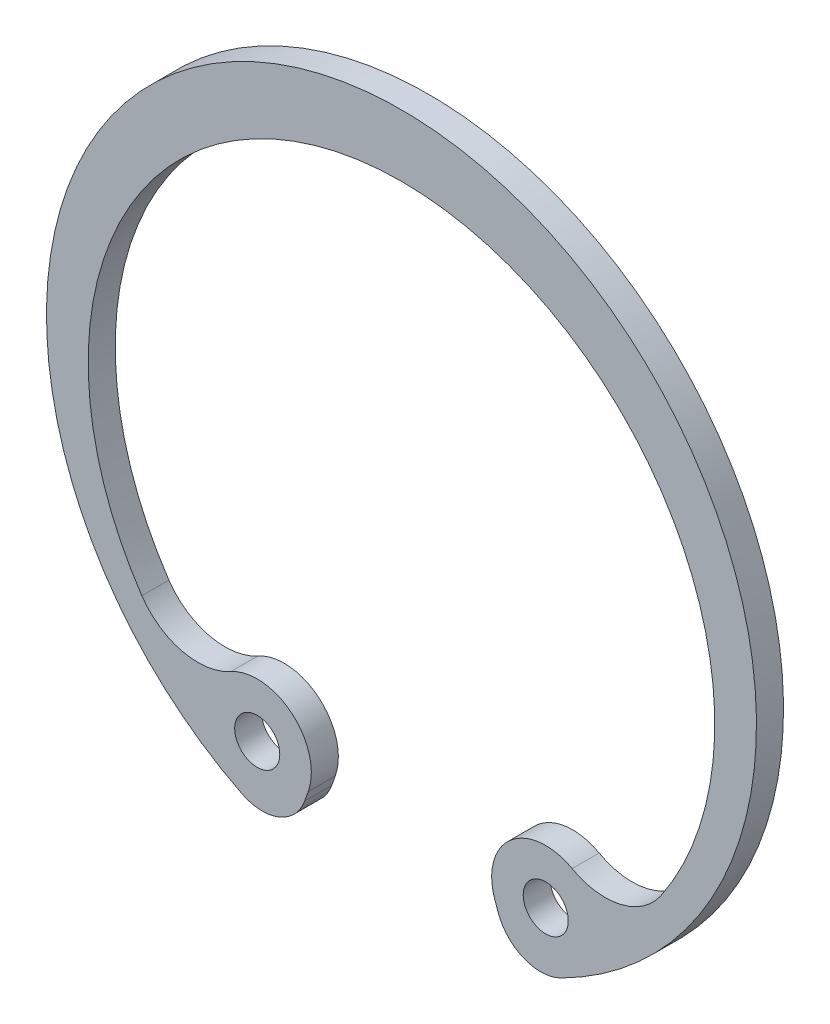
ISO-10303-21;
HEADER;
FILE_DESCRIPTION(('STEP AP214'),'2;1');
FILE_NAME('part.step','',(''),(''),'','','');
FILE_SCHEMA(('AUTOMOTIVE_DESIGN { 1 0 10303 214 1 1 1 1 }'));
ENDSEC;
DATA;
#1=APPLICATION_CONTEXT('core data for automotive mechanical design processes');
#2=APPLICATION_PROTOCOL_DEFINITION('international standard','automotive_design',2000,#1);
#3=PRODUCT_CONTEXT('',#1,'mechanical');
#4=PRODUCT('Part','Part','',(#3));
#5=PRODUCT_RELATED_PRODUCT_CATEGORY('part','',(#4));
#6=PRODUCT_DEFINITION_FORMATION('','',#4);
#7=PRODUCT_DEFINITION_CONTEXT('part definition',#1,'design');
#8=PRODUCT_DEFINITION('design','',#6,#7);
#9=PRODUCT_DEFINITION_SHAPE('','',#8);
#10=(LENGTH_UNIT() NAMED_UNIT(*) SI_UNIT(.MILLI.,.METRE.));
#11=(NAMED_UNIT(*) PLANE_ANGLE_UNIT() SI_UNIT($,.RADIAN.));
#12=(NAMED_UNIT(*) SI_UNIT($,.STERADIAN.) SOLID_ANGLE_UNIT());
#13=UNCERTAINTY_MEASURE_WITH_UNIT(LENGTH_MEASURE(1.E-05),#10,'distance_accuracy_value','');
#14=(GEOMETRIC_REPRESENTATION_CONTEXT(3) GLOBAL_UNCERTAINTY_ASSIGNED_CONTEXT((#13)) GLOBAL_UNIT_ASSIGNED_CONTEXT((#10,
#11,#12)) REPRESENTATION_CONTEXT('',''));
#15=CARTESIAN_POINT('',(0.,0.,0.));
#16=DIRECTION('',(0.,0.,1.));
#17=DIRECTION('',(1.,0.,0.));
#18=AXIS2_PLACEMENT_3D('',#15,#16,#17);
#19=CARTESIAN_POINT('',(-6.17774308325366,-11.384054314326,1.2));
#20=DIRECTION('',(0.,0.,1.));
#21=DIRECTION('',(1.,0.,0.));
#22=AXIS2_PLACEMENT_3D('',#19,#20,#21);
#23=PLANE('',#22);
#24=CARTESIAN_POINT('',(-6.4,-10.8159079887135,1.2));
#25=DIRECTION('',(0.,0.,1.));
#26=DIRECTION('',(1.,0.,0.));
#27=AXIS2_PLACEMENT_3D('',#24,#25,#26);
#28=CIRCLE('',#27,1.);
#29=CARTESIAN_POINT('',(-5.4,-10.8159079887135,1.2));
#30=VERTEX_POINT('',#29);
#31=EDGE_CURVE('E145',#30,#30,#28,.T.);
#32=ORIENTED_EDGE('',*,*,#31,.F.);
#33=EDGE_LOOP('',(#32));
#34=FACE_BOUND('',#33,.T.);
#35=CARTESIAN_POINT('',(-6.17774308325366,-11.384054314326,1.2));
#36=DIRECTION('',(0.,0.,1.));
#37=DIRECTION('',(1.,0.,0.));
#38=AXIS2_PLACEMENT_3D('',#35,#36,#37);
#39=CIRCLE('',#38,2.);
#40=CARTESIAN_POINT('',(-7.07632389536327,-13.1708258509553,1.2));
#41=VERTEX_POINT('',#40);
#42=CARTESIAN_POINT('',(-4.29368008749084,-12.0551032156717,1.2));
#43=VERTEX_POINT('',#42);
#44=EDGE_CURVE('E160',#41,#43,#39,.T.);
#45=ORIENTED_EDGE('',*,*,#44,.T.);
#46=DIRECTION('',(0.335524450672837,0.942031497881409,0.));
#47=VECTOR('',#46,1.);
#48=CARTESIAN_POINT('',(-4.13912440508462,-11.6211666703283,1.2));
#49=LINE('',#48,#47);
#50=CARTESIAN_POINT('',(-4.13912440508462,-11.6211666703283,1.2));
#51=VERTEX_POINT('',#50);
#52=EDGE_CURVE('E98',#43,#51,#49,.T.);
#53=ORIENTED_EDGE('',*,*,#52,.T.);
#54=CARTESIAN_POINT('',(-6.4,-10.8159079887135,1.2));
#55=DIRECTION('',(0.,0.,1.));
#56=DIRECTION('',(1.,0.,0.));
#57=AXIS2_PLACEMENT_3D('',#54,#55,#56);
#58=CIRCLE('',#57,2.4);
#59=CARTESIAN_POINT('',(-7.57002157304939,-8.72042486575613,1.2));
#60=VERTEX_POINT('',#59);
#61=EDGE_CURVE('E181',#51,#60,#58,.T.);
#62=ORIENTED_EDGE('',*,*,#61,.T.);
#63=CARTESIAN_POINT('',(-9.03254853936113,-6.10107096205946,1.2));
#64=DIRECTION('',(0.,0.,-1.));
#65=DIRECTION('',(1.,0.,0.));
#66=AXIS2_PLACEMENT_3D('',#63,#64,#65);
#67=CIRCLE('',#66,3.);
#68=CARTESIAN_POINT('',(-11.5185710731302,-7.78026480482811,1.2));
#69=VERTEX_POINT('',#68);
#70=EDGE_CURVE('E200',#60,#69,#67,.T.);
#71=ORIENTED_EDGE('',*,*,#70,.T.);
#72=CARTESIAN_POINT('',(0.,0.,1.2));
#73=DIRECTION('',(0.,0.,-1.));
#74=DIRECTION('',(1.,0.,0.));
#75=AXIS2_PLACEMENT_3D('',#72,#73,#74);
#76=CIRCLE('',#75,13.9);
#77=CARTESIAN_POINT('',(11.5185710731302,-7.78026480482812,1.2));
#78=VERTEX_POINT('',#77);
#79=EDGE_CURVE('E197',#69,#78,#76,.T.);
#80=ORIENTED_EDGE('',*,*,#79,.T.);
#81=CARTESIAN_POINT('',(9.03254853936113,-6.10107096205946,1.2));
#82=DIRECTION('',(0.,0.,-1.));
#83=DIRECTION('',(-1.,0.,0.));
#84=AXIS2_PLACEMENT_3D('',#81,#82,#83);
#85=CIRCLE('',#84,3.);
#86=CARTESIAN_POINT('',(7.57002157304939,-8.72042486575613,1.2));
#87=VERTEX_POINT('',#86);
#88=EDGE_CURVE('E199',#78,#87,#85,.T.);
#89=ORIENTED_EDGE('',*,*,#88,.T.);
#90=CARTESIAN_POINT('',(6.4,-10.8159079887135,1.2));
#91=DIRECTION('',(0.,0.,1.));
#92=DIRECTION('',(-1.,0.,0.));
#93=AXIS2_PLACEMENT_3D('',#90,#91,#92);
#94=CIRCLE('',#93,2.4);
#95=CARTESIAN_POINT('',(4.13912440508462,-11.6211666703283,1.2));
#96=VERTEX_POINT('',#95);
#97=EDGE_CURVE('E123',#87,#96,#94,.T.);
#98=ORIENTED_EDGE('',*,*,#97,.T.);
#99=DIRECTION('',(0.335524450672837,-0.942031497881409,0.));
#100=VECTOR('',#99,1.);
#101=CARTESIAN_POINT('',(4.13912440508462,-11.6211666703283,1.2));
#102=LINE('',#101,#100);
#103=CARTESIAN_POINT('',(4.29368008749084,-12.0551032156717,1.2));
#104=VERTEX_POINT('',#103);
#105=EDGE_CURVE('E117',#96,#104,#102,.T.);
#106=ORIENTED_EDGE('',*,*,#105,.T.);
#107=CARTESIAN_POINT('',(6.17774308325366,-11.384054314326,1.2));
#108=DIRECTION('',(0.,0.,1.));
#109=DIRECTION('',(-1.,0.,0.));
#110=AXIS2_PLACEMENT_3D('',#107,#108,#109);
#111=CIRCLE('',#110,2.);
#112=CARTESIAN_POINT('',(7.07632389536328,-13.1708258509553,1.2));
#113=VERTEX_POINT('',#112);
#114=EDGE_CURVE('E121',#104,#113,#111,.T.);
#115=ORIENTED_EDGE('',*,*,#114,.T.);
#116=CARTESIAN_POINT('',(0.,0.9,1.2));
#117=DIRECTION('',(0.,0.,1.));
#118=DIRECTION('',(-1.,0.,0.));
#119=AXIS2_PLACEMENT_3D('',#116,#117,#118);
#120=CIRCLE('',#119,15.75);
#121=EDGE_CURVE('E49',#113,#41,#120,.T.);
#122=ORIENTED_EDGE('',*,*,#121,.T.);
#123=EDGE_LOOP('',(#45,#53,#62,#71,#80,#89,#98,#106,#115,#122));
#124=FACE_BOUND('',#123,.T.);
#125=CARTESIAN_POINT('',(6.4,-10.8159079887135,1.2));
#126=DIRECTION('',(0.,0.,1.));
#127=DIRECTION('',(-1.,0.,0.));
#128=AXIS2_PLACEMENT_3D('',#125,#126,#127);
#129=CIRCLE('',#128,1.);
#130=CARTESIAN_POINT('',(5.4,-10.8159079887135,1.2));
#131=VERTEX_POINT('',#130);
#132=EDGE_CURVE('E211',#131,#131,#129,.T.);
#133=ORIENTED_EDGE('',*,*,#132,.F.);
#134=EDGE_LOOP('',(#133));
#135=FACE_BOUND('',#134,.T.);
#136=ADVANCED_FACE('F32',(#34,#124,#135),#23,.T.);
#137=CARTESIAN_POINT('',(-6.17774308325366,-11.384054314326,0.));
#138=DIRECTION('',(0.,0.,1.));
#139=DIRECTION('',(1.,0.,0.));
#140=AXIS2_PLACEMENT_3D('',#137,#138,#139);
#141=PLANE('',#140);
#142=CARTESIAN_POINT('',(-6.17774308325366,-11.384054314326,0.));
#143=DIRECTION('',(0.,0.,1.));
#144=DIRECTION('',(1.,0.,0.));
#145=AXIS2_PLACEMENT_3D('',#142,#143,#144);
#146=CIRCLE('',#145,2.);
#147=CARTESIAN_POINT('',(-7.07632389536327,-13.1708258509553,0.));
#148=VERTEX_POINT('',#147);
#149=CARTESIAN_POINT('',(-4.29368008749084,-12.0551032156717,0.));
#150=VERTEX_POINT('',#149);
#151=EDGE_CURVE('E141',#148,#150,#146,.T.);
#152=ORIENTED_EDGE('',*,*,#151,.F.);
#153=CARTESIAN_POINT('',(0.,0.9,0.));
#154=DIRECTION('',(0.,0.,1.));
#155=DIRECTION('',(-1.,0.,0.));
#156=AXIS2_PLACEMENT_3D('',#153,#154,#155);
#157=CIRCLE('',#156,15.75);
#158=CARTESIAN_POINT('',(7.07632389536328,-13.1708258509553,0.));
#159=VERTEX_POINT('',#158);
#160=EDGE_CURVE('E90',#159,#148,#157,.T.);
#161=ORIENTED_EDGE('',*,*,#160,.F.);
#162=CARTESIAN_POINT('',(6.17774308325366,-11.384054314326,0.));
#163=DIRECTION('',(0.,0.,1.));
#164=DIRECTION('',(-1.,0.,0.));
#165=AXIS2_PLACEMENT_3D('',#162,#163,#164);
#166=CIRCLE('',#165,2.);
#167=CARTESIAN_POINT('',(4.29368008749084,-12.0551032156717,0.));
#168=VERTEX_POINT('',#167);
#169=EDGE_CURVE('E84',#168,#159,#166,.T.);
#170=ORIENTED_EDGE('',*,*,#169,.F.);
#171=DIRECTION('',(0.335524450672837,-0.942031497881409,0.));
#172=VECTOR('',#171,1.);
#173=CARTESIAN_POINT('',(4.13912440508462,-11.6211666703283,0.));
#174=LINE('',#173,#172);
#175=CARTESIAN_POINT('',(4.13912440508462,-11.6211666703283,0.));
#176=VERTEX_POINT('',#175);
#177=EDGE_CURVE('E131',#176,#168,#174,.T.);
#178=ORIENTED_EDGE('',*,*,#177,.F.);
#179=CARTESIAN_POINT('',(6.4,-10.8159079887135,0.));
#180=DIRECTION('',(0.,0.,1.));
#181=DIRECTION('',(-1.,0.,0.));
#182=AXIS2_PLACEMENT_3D('',#179,#180,#181);
#183=CIRCLE('',#182,2.4);
#184=CARTESIAN_POINT('',(7.57002157304939,-8.72042486575613,0.));
#185=VERTEX_POINT('',#184);
#186=EDGE_CURVE('E155',#185,#176,#183,.T.);
#187=ORIENTED_EDGE('',*,*,#186,.F.);
#188=CARTESIAN_POINT('',(9.03254853936113,-6.10107096205946,0.));
#189=DIRECTION('',(0.,0.,-1.));
#190=DIRECTION('',(-1.,0.,0.));
#191=AXIS2_PLACEMENT_3D('',#188,#189,#190);
#192=CIRCLE('',#191,3.);
#193=CARTESIAN_POINT('',(11.5185710731302,-7.78026480482812,0.));
#194=VERTEX_POINT('',#193);
#195=EDGE_CURVE('E153',#194,#185,#192,.T.);
#196=ORIENTED_EDGE('',*,*,#195,.F.);
#197=CARTESIAN_POINT('',(0.,0.,0.));
#198=DIRECTION('',(0.,0.,-1.));
#199=DIRECTION('',(1.,0.,0.));
#200=AXIS2_PLACEMENT_3D('',#197,#198,#199);
#201=CIRCLE('',#200,13.9);
#202=CARTESIAN_POINT('',(-11.5185710731302,-7.78026480482811,0.));
#203=VERTEX_POINT('',#202);
#204=EDGE_CURVE('E151',#203,#194,#201,.T.);
#205=ORIENTED_EDGE('',*,*,#204,.F.);
#206=CARTESIAN_POINT('',(-9.03254853936113,-6.10107096205946,0.));
#207=DIRECTION('',(0.,0.,-1.));
#208=DIRECTION('',(1.,0.,0.));
#209=AXIS2_PLACEMENT_3D('',#206,#207,#208);
#210=CIRCLE('',#209,3.);
#211=CARTESIAN_POINT('',(-7.57002157304939,-8.72042486575613,0.));
#212=VERTEX_POINT('',#211);
#213=EDGE_CURVE('E149',#212,#203,#210,.T.);
#214=ORIENTED_EDGE('',*,*,#213,.F.);
#215=CARTESIAN_POINT('',(-6.4,-10.8159079887135,0.));
#216=DIRECTION('',(0.,0.,1.));
#217=DIRECTION('',(1.,0.,0.));
#218=AXIS2_PLACEMENT_3D('',#215,#216,#217);
#219=CIRCLE('',#218,2.4);
#220=CARTESIAN_POINT('',(-4.13912440508462,-11.6211666703283,0.));
#221=VERTEX_POINT('',#220);
#222=EDGE_CURVE('E147',#221,#212,#219,.T.);
#223=ORIENTED_EDGE('',*,*,#222,.F.);
#224=DIRECTION('',(0.335524450672837,0.942031497881409,0.));
#225=VECTOR('',#224,1.);
#226=CARTESIAN_POINT('',(-4.13912440508462,-11.6211666703283,0.));
#227=LINE('',#226,#225);
#228=EDGE_CURVE('E144',#150,#221,#227,.T.);
#229=ORIENTED_EDGE('',*,*,#228,.F.);
#230=EDGE_LOOP('',(#152,#161,#170,#178,#187,#196,#205,#214,#223,#229));
#231=FACE_BOUND('',#230,.T.);
#232=CARTESIAN_POINT('',(-6.4,-10.8159079887135,0.));
#233=DIRECTION('',(0.,0.,1.));
#234=DIRECTION('',(1.,0.,0.));
#235=AXIS2_PLACEMENT_3D('',#232,#233,#234);
#236=CIRCLE('',#235,1.);
#237=CARTESIAN_POINT('',(-5.4,-10.8159079887135,0.));
#238=VERTEX_POINT('',#237);
#239=EDGE_CURVE('E208',#238,#238,#236,.T.);
#240=ORIENTED_EDGE('',*,*,#239,.T.);
#241=EDGE_LOOP('',(#240));
#242=FACE_BOUND('',#241,.T.);
#243=CARTESIAN_POINT('',(6.4,-10.8159079887135,0.));
#244=DIRECTION('',(0.,0.,1.));
#245=DIRECTION('',(-1.,0.,0.));
#246=AXIS2_PLACEMENT_3D('',#243,#244,#245);
#247=CIRCLE('',#246,1.);
#248=CARTESIAN_POINT('',(5.4,-10.8159079887135,0.));
#249=VERTEX_POINT('',#248);
#250=EDGE_CURVE('E214',#249,#249,#247,.T.);
#251=ORIENTED_EDGE('',*,*,#250,.T.);
#252=EDGE_LOOP('',(#251));
#253=FACE_BOUND('',#252,.T.);
#254=ADVANCED_FACE('F185',(#231,#242,#253),#141,.F.);
#255=CARTESIAN_POINT('',(-6.17774308325366,-11.384054314326,1.2));
#256=DIRECTION('',(0.,0.,-1.));
#257=DIRECTION('',(-1.,0.,0.));
#258=AXIS2_PLACEMENT_3D('',#255,#256,#257);
#259=CYLINDRICAL_SURFACE('',#258,2.);
#260=ORIENTED_EDGE('',*,*,#151,.T.);
#261=DIRECTION('',(0.,0.,-1.));
#262=VECTOR('',#261,1.);
#263=CARTESIAN_POINT('',(-4.29368008749084,-12.0551032156717,1.2));
#264=LINE('',#263,#262);
#265=EDGE_CURVE('E11',#43,#150,#264,.T.);
#266=ORIENTED_EDGE('',*,*,#265,.F.);
#267=ORIENTED_EDGE('',*,*,#44,.F.);
#268=DIRECTION('',(0.,0.,-1.));
#269=VECTOR('',#268,1.);
#270=CARTESIAN_POINT('',(-7.07632389536327,-13.1708258509553,1.2));
#271=LINE('',#270,#269);
#272=EDGE_CURVE('E137',#41,#148,#271,.T.);
#273=ORIENTED_EDGE('',*,*,#272,.T.);
#274=EDGE_LOOP('',(#260,#266,#267,#273));
#275=FACE_BOUND('',#274,.T.);
#276=ADVANCED_FACE('F34',(#275),#259,.T.);
#277=CARTESIAN_POINT('',(-4.13912440508462,-11.6211666703283,1.2));
#278=DIRECTION('',(-0.942031497881409,0.335524450672837,0.));
#279=DIRECTION('',(-0.335524450672837,-0.942031497881409,0.));
#280=AXIS2_PLACEMENT_3D('',#277,#278,#279);
#281=PLANE('',#280);
#282=ORIENTED_EDGE('',*,*,#228,.T.);
#283=DIRECTION('',(0.,0.,-1.));
#284=VECTOR('',#283,1.);
#285=CARTESIAN_POINT('',(-4.13912440508462,-11.6211666703283,1.2));
#286=LINE('',#285,#284);
#287=EDGE_CURVE('E41',#51,#221,#286,.T.);
#288=ORIENTED_EDGE('',*,*,#287,.F.);
#289=ORIENTED_EDGE('',*,*,#52,.F.);
#290=ORIENTED_EDGE('',*,*,#265,.T.);
#291=EDGE_LOOP('',(#282,#288,#289,#290));
#292=FACE_BOUND('',#291,.T.);
#293=ADVANCED_FACE('F254',(#292),#281,.F.);
#294=CARTESIAN_POINT('',(-6.4,-10.8159079887135,1.2));
#295=DIRECTION('',(0.,0.,-1.));
#296=DIRECTION('',(-1.,0.,0.));
#297=AXIS2_PLACEMENT_3D('',#294,#295,#296);
#298=CYLINDRICAL_SURFACE('',#297,2.4);
#299=ORIENTED_EDGE('',*,*,#222,.T.);
#300=DIRECTION('',(0.,0.,-1.));
#301=VECTOR('',#300,1.);
#302=CARTESIAN_POINT('',(-7.57002157304939,-8.72042486575613,1.2));
#303=LINE('',#302,#301);
#304=EDGE_CURVE('E173',#60,#212,#303,.T.);
#305=ORIENTED_EDGE('',*,*,#304,.F.);
#306=ORIENTED_EDGE('',*,*,#61,.F.);
#307=ORIENTED_EDGE('',*,*,#287,.T.);
#308=EDGE_LOOP('',(#299,#305,#306,#307));
#309=FACE_BOUND('',#308,.T.);
#310=ADVANCED_FACE('F179',(#309),#298,.T.);
#311=CARTESIAN_POINT('',(-9.03254853936113,-6.10107096205946,1.2));
#312=DIRECTION('',(0.,0.,-1.));
#313=DIRECTION('',(-1.,0.,0.));
#314=AXIS2_PLACEMENT_3D('',#311,#312,#313);
#315=CYLINDRICAL_SURFACE('',#314,3.);
#316=ORIENTED_EDGE('',*,*,#213,.T.);
#317=DIRECTION('',(0.,0.,-1.));
#318=VECTOR('',#317,1.);
#319=CARTESIAN_POINT('',(-11.5185710731302,-7.78026480482811,1.2));
#320=LINE('',#319,#318);
#321=EDGE_CURVE('E170',#69,#203,#320,.T.);
#322=ORIENTED_EDGE('',*,*,#321,.F.);
#323=ORIENTED_EDGE('',*,*,#70,.F.);
#324=ORIENTED_EDGE('',*,*,#304,.T.);
#325=EDGE_LOOP('',(#316,#322,#323,#324));
#326=FACE_BOUND('',#325,.T.);
#327=ADVANCED_FACE('F191',(#326),#315,.F.);
#328=CARTESIAN_POINT('',(0.,0.,1.2));
#329=DIRECTION('',(0.,0.,-1.));
#330=DIRECTION('',(-1.,0.,0.));
#331=AXIS2_PLACEMENT_3D('',#328,#329,#330);
#332=CYLINDRICAL_SURFACE('',#331,13.9);
#333=ORIENTED_EDGE('',*,*,#204,.T.);
#334=DIRECTION('',(0.,0.,-1.));
#335=VECTOR('',#334,1.);
#336=CARTESIAN_POINT('',(11.5185710731302,-7.78026480482812,1.2));
#337=LINE('',#336,#335);
#338=EDGE_CURVE('E167',#78,#194,#337,.T.);
#339=ORIENTED_EDGE('',*,*,#338,.F.);
#340=ORIENTED_EDGE('',*,*,#79,.F.);
#341=ORIENTED_EDGE('',*,*,#321,.T.);
#342=EDGE_LOOP('',(#333,#339,#340,#341));
#343=FACE_BOUND('',#342,.T.);
#344=ADVANCED_FACE('F195',(#343),#332,.F.);
#345=CARTESIAN_POINT('',(9.03254853936113,-6.10107096205946,1.2));
#346=DIRECTION('',(0.,0.,-1.));
#347=DIRECTION('',(-1.,0.,0.));
#348=AXIS2_PLACEMENT_3D('',#345,#346,#347);
#349=CYLINDRICAL_SURFACE('',#348,3.);
#350=ORIENTED_EDGE('',*,*,#195,.T.);
#351=DIRECTION('',(0.,0.,-1.));
#352=VECTOR('',#351,1.);
#353=CARTESIAN_POINT('',(7.57002157304939,-8.72042486575613,1.2));
#354=LINE('',#353,#352);
#355=EDGE_CURVE('E164',#87,#185,#354,.T.);
#356=ORIENTED_EDGE('',*,*,#355,.F.);
#357=ORIENTED_EDGE('',*,*,#88,.F.);
#358=ORIENTED_EDGE('',*,*,#338,.T.);
#359=EDGE_LOOP('',(#350,#356,#357,#358));
#360=FACE_BOUND('',#359,.T.);
#361=ADVANCED_FACE('F244',(#360),#349,.F.);
#362=CARTESIAN_POINT('',(6.4,-10.8159079887135,1.2));
#363=DIRECTION('',(0.,0.,-1.));
#364=DIRECTION('',(-1.,0.,0.));
#365=AXIS2_PLACEMENT_3D('',#362,#363,#364);
#366=CYLINDRICAL_SURFACE('',#365,2.4);
#367=ORIENTED_EDGE('',*,*,#186,.T.);
#368=DIRECTION('',(0.,0.,-1.));
#369=VECTOR('',#368,1.);
#370=CARTESIAN_POINT('',(4.13912440508462,-11.6211666703283,1.2));
#371=LINE('',#370,#369);
#372=EDGE_CURVE('E132',#96,#176,#371,.T.);
#373=ORIENTED_EDGE('',*,*,#372,.F.);
#374=ORIENTED_EDGE('',*,*,#97,.F.);
#375=ORIENTED_EDGE('',*,*,#355,.T.);
#376=EDGE_LOOP('',(#367,#373,#374,#375));
#377=FACE_BOUND('',#376,.T.);
#378=ADVANCED_FACE('F241',(#377),#366,.T.);
#379=CARTESIAN_POINT('',(4.13912440508462,-11.6211666703283,1.2));
#380=DIRECTION('',(0.942031497881409,0.335524450672837,0.));
#381=DIRECTION('',(-0.335524450672837,0.942031497881409,0.));
#382=AXIS2_PLACEMENT_3D('',#379,#380,#381);
#383=PLANE('',#382);
#384=ORIENTED_EDGE('',*,*,#177,.T.);
#385=DIRECTION('',(0.,0.,-1.));
#386=VECTOR('',#385,1.);
#387=CARTESIAN_POINT('',(4.29368008749084,-12.0551032156717,1.2));
#388=LINE('',#387,#386);
#389=EDGE_CURVE('E128',#104,#168,#388,.T.);
#390=ORIENTED_EDGE('',*,*,#389,.F.);
#391=ORIENTED_EDGE('',*,*,#105,.F.);
#392=ORIENTED_EDGE('',*,*,#372,.T.);
#393=EDGE_LOOP('',(#384,#390,#391,#392));
#394=FACE_BOUND('',#393,.T.);
#395=ADVANCED_FACE('F129',(#394),#383,.F.);
#396=CARTESIAN_POINT('',(6.17774308325366,-11.384054314326,1.2));
#397=DIRECTION('',(0.,0.,-1.));
#398=DIRECTION('',(-1.,0.,0.));
#399=AXIS2_PLACEMENT_3D('',#396,#397,#398);
#400=CYLINDRICAL_SURFACE('',#399,2.);
#401=ORIENTED_EDGE('',*,*,#169,.T.);
#402=DIRECTION('',(0.,0.,-1.));
#403=VECTOR('',#402,1.);
#404=CARTESIAN_POINT('',(7.07632389536328,-13.1708258509553,1.2));
#405=LINE('',#404,#403);
#406=EDGE_CURVE('E133',#113,#159,#405,.T.);
#407=ORIENTED_EDGE('',*,*,#406,.F.);
#408=ORIENTED_EDGE('',*,*,#114,.F.);
#409=ORIENTED_EDGE('',*,*,#389,.T.);
#410=EDGE_LOOP('',(#401,#407,#408,#409));
#411=FACE_BOUND('',#410,.T.);
#412=ADVANCED_FACE('F135',(#411),#400,.T.);
#413=CARTESIAN_POINT('',(0.,0.9,1.2));
#414=DIRECTION('',(0.,0.,-1.));
#415=DIRECTION('',(-1.,0.,0.));
#416=AXIS2_PLACEMENT_3D('',#413,#414,#415);
#417=CYLINDRICAL_SURFACE('',#416,15.75);
#418=ORIENTED_EDGE('',*,*,#160,.T.);
#419=ORIENTED_EDGE('',*,*,#272,.F.);
#420=ORIENTED_EDGE('',*,*,#121,.F.);
#421=ORIENTED_EDGE('',*,*,#406,.T.);
#422=EDGE_LOOP('',(#418,#419,#420,#421));
#423=FACE_BOUND('',#422,.T.);
#424=ADVANCED_FACE('F234',(#423),#417,.T.);
#425=CARTESIAN_POINT('',(-6.4,-10.8159079887135,1.2));
#426=DIRECTION('',(0.,0.,-1.));
#427=DIRECTION('',(-1.,0.,0.));
#428=AXIS2_PLACEMENT_3D('',#425,#426,#427);
#429=CYLINDRICAL_SURFACE('',#428,1.);
#430=ORIENTED_EDGE('',*,*,#31,.T.);
#431=EDGE_LOOP('',(#430));
#432=FACE_BOUND('',#431,.T.);
#433=ORIENTED_EDGE('',*,*,#239,.F.);
#434=EDGE_LOOP('',(#433));
#435=FACE_BOUND('',#434,.T.);
#436=ADVANCED_FACE('F231',(#432,#435),#429,.F.);
#437=CARTESIAN_POINT('',(6.4,-10.8159079887135,1.2));
#438=DIRECTION('',(0.,0.,-1.));
#439=DIRECTION('',(-1.,0.,0.));
#440=AXIS2_PLACEMENT_3D('',#437,#438,#439);
#441=CYLINDRICAL_SURFACE('',#440,1.);
#442=ORIENTED_EDGE('',*,*,#132,.T.);
#443=EDGE_LOOP('',(#442));
#444=FACE_BOUND('',#443,.T.);
#445=ORIENTED_EDGE('',*,*,#250,.F.);
#446=EDGE_LOOP('',(#445));
#447=FACE_BOUND('',#446,.T.);
#448=ADVANCED_FACE('F220',(#444,#447),#441,.F.);
#449=CLOSED_SHELL('',(#136,#254,#276,#293,#310,#327,#344,#361,#378,#395,#412,#424,#436,#448));
#450=MANIFOLD_SOLID_BREP('B2',#449);
#451=ADVANCED_BREP_SHAPE_REPRESENTATION('',(#18,#450),#14);
#452=SHAPE_DEFINITION_REPRESENTATION(#9,#451);
ENDSEC;
END-ISO-10303-21;
